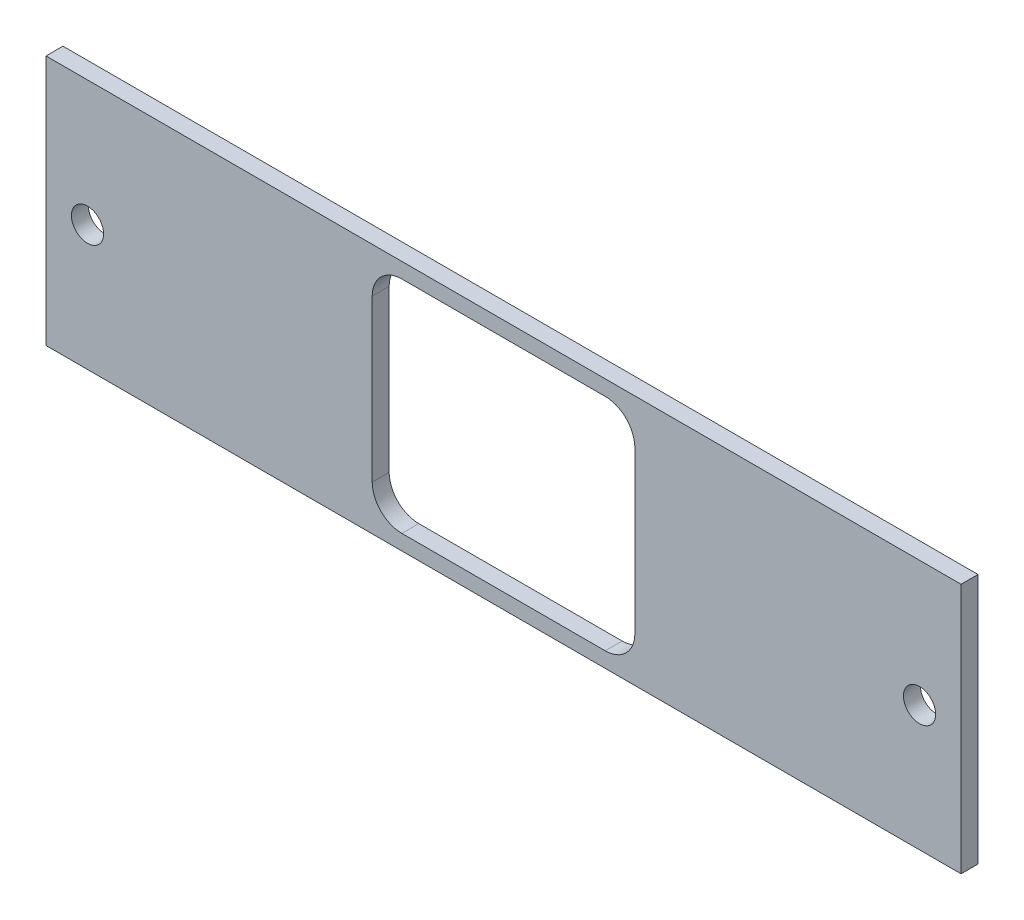
ISO-10303-21;
HEADER;
FILE_DESCRIPTION(('STEP AP214'),'2;1');
FILE_NAME('part.step','',(''),(''),'','','');
FILE_SCHEMA(('AUTOMOTIVE_DESIGN { 1 0 10303 214 1 1 1 1 }'));
ENDSEC;
DATA;
#1=APPLICATION_CONTEXT('core data for automotive mechanical design processes');
#2=APPLICATION_PROTOCOL_DEFINITION('international standard','automotive_design',2000,#1);
#3=PRODUCT_CONTEXT('',#1,'mechanical');
#4=PRODUCT('Part','Part','',(#3));
#5=PRODUCT_RELATED_PRODUCT_CATEGORY('part','',(#4));
#6=PRODUCT_DEFINITION_FORMATION('','',#4);
#7=PRODUCT_DEFINITION_CONTEXT('part definition',#1,'design');
#8=PRODUCT_DEFINITION('design','',#6,#7);
#9=PRODUCT_DEFINITION_SHAPE('','',#8);
#10=(LENGTH_UNIT() NAMED_UNIT(*) SI_UNIT(.MILLI.,.METRE.));
#11=(NAMED_UNIT(*) PLANE_ANGLE_UNIT() SI_UNIT($,.RADIAN.));
#12=(NAMED_UNIT(*) SI_UNIT($,.STERADIAN.) SOLID_ANGLE_UNIT());
#13=UNCERTAINTY_MEASURE_WITH_UNIT(LENGTH_MEASURE(1.E-05),#10,'distance_accuracy_value','');
#14=(GEOMETRIC_REPRESENTATION_CONTEXT(3) GLOBAL_UNCERTAINTY_ASSIGNED_CONTEXT((#13)) GLOBAL_UNIT_ASSIGNED_CONTEXT((#10,
#11,#12)) REPRESENTATION_CONTEXT('',''));
#15=CARTESIAN_POINT('',(0.,0.,0.));
#16=DIRECTION('',(0.,0.,1.));
#17=DIRECTION('',(1.,0.,0.));
#18=AXIS2_PLACEMENT_3D('',#15,#16,#17);
#19=CARTESIAN_POINT('',(54.,-14.8,-2.));
#20=DIRECTION('',(1.,0.,0.));
#21=DIRECTION('',(0.,0.,-1.));
#22=AXIS2_PLACEMENT_3D('',#19,#20,#21);
#23=PLANE('',#22);
#24=DIRECTION('',(0.,1.,0.));
#25=VECTOR('',#24,1.);
#26=CARTESIAN_POINT('',(54.,-14.8,0.));
#27=LINE('',#26,#25);
#28=CARTESIAN_POINT('',(54.,-14.8,0.));
#29=VERTEX_POINT('',#28);
#30=CARTESIAN_POINT('',(54.,14.8,0.));
#31=VERTEX_POINT('',#30);
#32=EDGE_CURVE('E200',#29,#31,#27,.T.);
#33=ORIENTED_EDGE('',*,*,#32,.F.);
#34=DIRECTION('',(0.,0.,1.));
#35=VECTOR('',#34,1.);
#36=CARTESIAN_POINT('',(54.,-14.8,-2.));
#37=LINE('',#36,#35);
#38=CARTESIAN_POINT('',(54.,-14.8,-2.));
#39=VERTEX_POINT('',#38);
#40=EDGE_CURVE('E11',#39,#29,#37,.T.);
#41=ORIENTED_EDGE('',*,*,#40,.F.);
#42=DIRECTION('',(0.,1.,0.));
#43=VECTOR('',#42,1.);
#44=CARTESIAN_POINT('',(54.,-14.8,-2.));
#45=LINE('',#44,#43);
#46=CARTESIAN_POINT('',(54.,14.8,-2.));
#47=VERTEX_POINT('',#46);
#48=EDGE_CURVE('E203',#39,#47,#45,.T.);
#49=ORIENTED_EDGE('',*,*,#48,.T.);
#50=DIRECTION('',(0.,0.,1.));
#51=VECTOR('',#50,1.);
#52=CARTESIAN_POINT('',(54.,14.8,-2.));
#53=LINE('',#52,#51);
#54=EDGE_CURVE('E36',#47,#31,#53,.T.);
#55=ORIENTED_EDGE('',*,*,#54,.T.);
#56=EDGE_LOOP('',(#33,#41,#49,#55));
#57=FACE_BOUND('',#56,.T.);
#58=ADVANCED_FACE('F33',(#57),#23,.T.);
#59=CARTESIAN_POINT('',(-54.,-14.8,-2.));
#60=DIRECTION('',(0.,-1.,0.));
#61=DIRECTION('',(0.,0.,-1.));
#62=AXIS2_PLACEMENT_3D('',#59,#60,#61);
#63=PLANE('',#62);
#64=DIRECTION('',(1.,0.,0.));
#65=VECTOR('',#64,1.);
#66=CARTESIAN_POINT('',(-54.,-14.8,0.));
#67=LINE('',#66,#65);
#68=CARTESIAN_POINT('',(-54.,-14.8,0.));
#69=VERTEX_POINT('',#68);
#70=EDGE_CURVE('E207',#69,#29,#67,.T.);
#71=ORIENTED_EDGE('',*,*,#70,.F.);
#72=DIRECTION('',(0.,0.,1.));
#73=VECTOR('',#72,1.);
#74=CARTESIAN_POINT('',(-54.,-14.8,-2.));
#75=LINE('',#74,#73);
#76=CARTESIAN_POINT('',(-54.,-14.8,-2.));
#77=VERTEX_POINT('',#76);
#78=EDGE_CURVE('E41',#77,#69,#75,.T.);
#79=ORIENTED_EDGE('',*,*,#78,.F.);
#80=DIRECTION('',(1.,0.,0.));
#81=VECTOR('',#80,1.);
#82=CARTESIAN_POINT('',(-54.,-14.8,-2.));
#83=LINE('',#82,#81);
#84=EDGE_CURVE('E213',#77,#39,#83,.T.);
#85=ORIENTED_EDGE('',*,*,#84,.T.);
#86=ORIENTED_EDGE('',*,*,#40,.T.);
#87=EDGE_LOOP('',(#71,#79,#85,#86));
#88=FACE_BOUND('',#87,.T.);
#89=ADVANCED_FACE('F239',(#88),#63,.T.);
#90=CARTESIAN_POINT('',(-54.,-14.8,-2.));
#91=DIRECTION('',(-1.,0.,0.));
#92=DIRECTION('',(0.,0.,1.));
#93=AXIS2_PLACEMENT_3D('',#90,#91,#92);
#94=PLANE('',#93);
#95=DIRECTION('',(0.,-1.,0.));
#96=VECTOR('',#95,1.);
#97=CARTESIAN_POINT('',(-54.,-14.8,0.));
#98=LINE('',#97,#96);
#99=CARTESIAN_POINT('',(-54.,14.8,0.));
#100=VERTEX_POINT('',#99);
#101=EDGE_CURVE('E221',#100,#69,#98,.T.);
#102=ORIENTED_EDGE('',*,*,#101,.F.);
#103=DIRECTION('',(0.,0.,1.));
#104=VECTOR('',#103,1.);
#105=CARTESIAN_POINT('',(-54.,14.8,-2.));
#106=LINE('',#105,#104);
#107=CARTESIAN_POINT('',(-54.,14.8,-2.));
#108=VERTEX_POINT('',#107);
#109=EDGE_CURVE('E226',#108,#100,#106,.T.);
#110=ORIENTED_EDGE('',*,*,#109,.F.);
#111=DIRECTION('',(0.,-1.,0.));
#112=VECTOR('',#111,1.);
#113=CARTESIAN_POINT('',(-54.,-14.8,-2.));
#114=LINE('',#113,#112);
#115=EDGE_CURVE('E210',#108,#77,#114,.T.);
#116=ORIENTED_EDGE('',*,*,#115,.T.);
#117=ORIENTED_EDGE('',*,*,#78,.T.);
#118=EDGE_LOOP('',(#102,#110,#116,#117));
#119=FACE_BOUND('',#118,.T.);
#120=ADVANCED_FACE('F244',(#119),#94,.T.);
#121=CARTESIAN_POINT('',(-54.,14.8,-2.));
#122=DIRECTION('',(0.,1.,0.));
#123=DIRECTION('',(0.,0.,1.));
#124=AXIS2_PLACEMENT_3D('',#121,#122,#123);
#125=PLANE('',#124);
#126=DIRECTION('',(-1.,0.,0.));
#127=VECTOR('',#126,1.);
#128=CARTESIAN_POINT('',(-54.,14.8,0.));
#129=LINE('',#128,#127);
#130=EDGE_CURVE('E218',#31,#100,#129,.T.);
#131=ORIENTED_EDGE('',*,*,#130,.F.);
#132=ORIENTED_EDGE('',*,*,#54,.F.);
#133=DIRECTION('',(-1.,0.,0.));
#134=VECTOR('',#133,1.);
#135=CARTESIAN_POINT('',(-54.,14.8,-2.));
#136=LINE('',#135,#134);
#137=EDGE_CURVE('E206',#47,#108,#136,.T.);
#138=ORIENTED_EDGE('',*,*,#137,.T.);
#139=ORIENTED_EDGE('',*,*,#109,.T.);
#140=EDGE_LOOP('',(#131,#132,#138,#139));
#141=FACE_BOUND('',#140,.T.);
#142=ADVANCED_FACE('F234',(#141),#125,.T.);
#143=CARTESIAN_POINT('',(54.,14.8,-2.));
#144=DIRECTION('',(0.,0.,-1.));
#145=DIRECTION('',(-1.,0.,0.));
#146=AXIS2_PLACEMENT_3D('',#143,#144,#145);
#147=PLANE('',#146);
#148=CARTESIAN_POINT('',(-12.,-9.50000000000004,-2.));
#149=DIRECTION('',(0.,0.,1.));
#150=DIRECTION('',(1.,0.,0.));
#151=AXIS2_PLACEMENT_3D('',#148,#149,#150);
#152=CIRCLE('',#151,3.5);
#153=CARTESIAN_POINT('',(-15.5,-9.50000000000005,-2.));
#154=VERTEX_POINT('',#153);
#155=CARTESIAN_POINT('',(-12.,-13.,-2.));
#156=VERTEX_POINT('',#155);
#157=EDGE_CURVE('E124',#154,#156,#152,.T.);
#158=ORIENTED_EDGE('',*,*,#157,.T.);
#159=DIRECTION('',(1.,0.,0.));
#160=VECTOR('',#159,1.);
#161=CARTESIAN_POINT('',(-12.,-13.,-2.));
#162=LINE('',#161,#160);
#163=CARTESIAN_POINT('',(12.,-13.,-2.));
#164=VERTEX_POINT('',#163);
#165=EDGE_CURVE('E133',#156,#164,#162,.T.);
#166=ORIENTED_EDGE('',*,*,#165,.T.);
#167=CARTESIAN_POINT('',(12.,-9.49999999999996,-2.));
#168=DIRECTION('',(0.,0.,1.));
#169=DIRECTION('',(1.,0.,0.));
#170=AXIS2_PLACEMENT_3D('',#167,#168,#169);
#171=CIRCLE('',#170,3.5);
#172=CARTESIAN_POINT('',(15.5,-9.49999999999995,-2.));
#173=VERTEX_POINT('',#172);
#174=EDGE_CURVE('E49',#164,#173,#171,.T.);
#175=ORIENTED_EDGE('',*,*,#174,.T.);
#176=DIRECTION('',(0.,1.,0.));
#177=VECTOR('',#176,1.);
#178=CARTESIAN_POINT('',(15.5,-9.49999999999995,-2.));
#179=LINE('',#178,#177);
#180=CARTESIAN_POINT('',(15.5,9.50000000000005,-2.));
#181=VERTEX_POINT('',#180);
#182=EDGE_CURVE('E148',#173,#181,#179,.T.);
#183=ORIENTED_EDGE('',*,*,#182,.T.);
#184=CARTESIAN_POINT('',(12.,9.50000000000004,-2.));
#185=DIRECTION('',(0.,0.,1.));
#186=DIRECTION('',(1.,0.,0.));
#187=AXIS2_PLACEMENT_3D('',#184,#185,#186);
#188=CIRCLE('',#187,3.5);
#189=CARTESIAN_POINT('',(12.,13.,-2.));
#190=VERTEX_POINT('',#189);
#191=EDGE_CURVE('E151',#181,#190,#188,.T.);
#192=ORIENTED_EDGE('',*,*,#191,.T.);
#193=DIRECTION('',(-1.,0.,0.));
#194=VECTOR('',#193,1.);
#195=CARTESIAN_POINT('',(12.,13.,-2.));
#196=LINE('',#195,#194);
#197=CARTESIAN_POINT('',(-12.,13.,-2.));
#198=VERTEX_POINT('',#197);
#199=EDGE_CURVE('E154',#190,#198,#196,.T.);
#200=ORIENTED_EDGE('',*,*,#199,.T.);
#201=CARTESIAN_POINT('',(-12.,9.49999999999996,-2.));
#202=DIRECTION('',(0.,0.,1.));
#203=DIRECTION('',(1.,0.,0.));
#204=AXIS2_PLACEMENT_3D('',#201,#202,#203);
#205=CIRCLE('',#204,3.5);
#206=CARTESIAN_POINT('',(-15.5,9.49999999999995,-2.));
#207=VERTEX_POINT('',#206);
#208=EDGE_CURVE('E157',#198,#207,#205,.T.);
#209=ORIENTED_EDGE('',*,*,#208,.T.);
#210=DIRECTION('',(0.,-1.,0.));
#211=VECTOR('',#210,1.);
#212=CARTESIAN_POINT('',(-15.5,9.49999999999995,-2.));
#213=LINE('',#212,#211);
#214=EDGE_CURVE('E130',#207,#154,#213,.T.);
#215=ORIENTED_EDGE('',*,*,#214,.T.);
#216=EDGE_LOOP('',(#158,#166,#175,#183,#192,#200,#209,#215));
#217=FACE_BOUND('',#216,.T.);
#218=CARTESIAN_POINT('',(49.1,0.,-2.));
#219=DIRECTION('',(0.,0.,1.));
#220=DIRECTION('',(1.,0.,0.));
#221=AXIS2_PLACEMENT_3D('',#218,#219,#220);
#222=CIRCLE('',#221,1.9);
#223=CARTESIAN_POINT('',(51.,0.,-2.));
#224=VERTEX_POINT('',#223);
#225=EDGE_CURVE('E191',#224,#224,#222,.T.);
#226=ORIENTED_EDGE('',*,*,#225,.T.);
#227=EDGE_LOOP('',(#226));
#228=FACE_BOUND('',#227,.T.);
#229=CARTESIAN_POINT('',(-49.1,0.,-2.));
#230=DIRECTION('',(0.,0.,1.));
#231=DIRECTION('',(1.,0.,0.));
#232=AXIS2_PLACEMENT_3D('',#229,#230,#231);
#233=CIRCLE('',#232,1.9);
#234=CARTESIAN_POINT('',(-47.2,0.,-2.));
#235=VERTEX_POINT('',#234);
#236=EDGE_CURVE('E197',#235,#235,#233,.T.);
#237=ORIENTED_EDGE('',*,*,#236,.T.);
#238=EDGE_LOOP('',(#237));
#239=FACE_BOUND('',#238,.T.);
#240=ORIENTED_EDGE('',*,*,#48,.F.);
#241=ORIENTED_EDGE('',*,*,#84,.F.);
#242=ORIENTED_EDGE('',*,*,#115,.F.);
#243=ORIENTED_EDGE('',*,*,#137,.F.);
#244=EDGE_LOOP('',(#240,#241,#242,#243));
#245=FACE_BOUND('',#244,.T.);
#246=ADVANCED_FACE('F137',(#217,#228,#239,#245),#147,.T.);
#247=CARTESIAN_POINT('',(54.,14.8,0.));
#248=DIRECTION('',(0.,0.,-1.));
#249=DIRECTION('',(-1.,0.,0.));
#250=AXIS2_PLACEMENT_3D('',#247,#248,#249);
#251=PLANE('',#250);
#252=DIRECTION('',(1.,0.,0.));
#253=VECTOR('',#252,1.);
#254=CARTESIAN_POINT('',(-12.,-13.,0.));
#255=LINE('',#254,#253);
#256=CARTESIAN_POINT('',(-11.9999999999999,-13.,0.));
#257=VERTEX_POINT('',#256);
#258=CARTESIAN_POINT('',(12.,-13.,0.));
#259=VERTEX_POINT('',#258);
#260=EDGE_CURVE('E161',#257,#259,#255,.T.);
#261=ORIENTED_EDGE('',*,*,#260,.F.);
#262=CARTESIAN_POINT('',(-12.,-9.50000000000004,0.));
#263=DIRECTION('',(0.,0.,1.));
#264=DIRECTION('',(1.,0.,0.));
#265=AXIS2_PLACEMENT_3D('',#262,#263,#264);
#266=CIRCLE('',#265,3.5);
#267=CARTESIAN_POINT('',(-15.5,-9.50000000000005,0.));
#268=VERTEX_POINT('',#267);
#269=EDGE_CURVE('E57',#268,#257,#266,.T.);
#270=ORIENTED_EDGE('',*,*,#269,.F.);
#271=DIRECTION('',(0.,-1.,0.));
#272=VECTOR('',#271,1.);
#273=CARTESIAN_POINT('',(-15.5,9.49999999999995,0.));
#274=LINE('',#273,#272);
#275=CARTESIAN_POINT('',(-15.5,9.49999999999995,0.));
#276=VERTEX_POINT('',#275);
#277=EDGE_CURVE('E141',#276,#268,#274,.T.);
#278=ORIENTED_EDGE('',*,*,#277,.F.);
#279=CARTESIAN_POINT('',(-12.,9.49999999999996,0.));
#280=DIRECTION('',(0.,0.,1.));
#281=DIRECTION('',(1.,0.,0.));
#282=AXIS2_PLACEMENT_3D('',#279,#280,#281);
#283=CIRCLE('',#282,3.5);
#284=CARTESIAN_POINT('',(-12.,13.,0.));
#285=VERTEX_POINT('',#284);
#286=EDGE_CURVE('E144',#285,#276,#283,.T.);
#287=ORIENTED_EDGE('',*,*,#286,.F.);
#288=DIRECTION('',(-1.,0.,0.));
#289=VECTOR('',#288,1.);
#290=CARTESIAN_POINT('',(12.,13.,0.));
#291=LINE('',#290,#289);
#292=CARTESIAN_POINT('',(12.,13.,0.));
#293=VERTEX_POINT('',#292);
#294=EDGE_CURVE('E172',#293,#285,#291,.T.);
#295=ORIENTED_EDGE('',*,*,#294,.F.);
#296=CARTESIAN_POINT('',(12.,9.50000000000004,0.));
#297=DIRECTION('',(0.,0.,1.));
#298=DIRECTION('',(1.,0.,0.));
#299=AXIS2_PLACEMENT_3D('',#296,#297,#298);
#300=CIRCLE('',#299,3.5);
#301=CARTESIAN_POINT('',(15.5,9.50000000000005,0.));
#302=VERTEX_POINT('',#301);
#303=EDGE_CURVE('E169',#302,#293,#300,.T.);
#304=ORIENTED_EDGE('',*,*,#303,.F.);
#305=DIRECTION('',(0.,1.,0.));
#306=VECTOR('',#305,1.);
#307=CARTESIAN_POINT('',(15.5,-9.49999999999995,0.));
#308=LINE('',#307,#306);
#309=CARTESIAN_POINT('',(15.5,-9.49999999999995,0.));
#310=VERTEX_POINT('',#309);
#311=EDGE_CURVE('E166',#310,#302,#308,.T.);
#312=ORIENTED_EDGE('',*,*,#311,.F.);
#313=CARTESIAN_POINT('',(12.,-9.49999999999996,0.));
#314=DIRECTION('',(0.,0.,1.));
#315=DIRECTION('',(1.,0.,0.));
#316=AXIS2_PLACEMENT_3D('',#313,#314,#315);
#317=CIRCLE('',#316,3.5);
#318=EDGE_CURVE('E163',#259,#310,#317,.T.);
#319=ORIENTED_EDGE('',*,*,#318,.F.);
#320=EDGE_LOOP('',(#261,#270,#278,#287,#295,#304,#312,#319));
#321=FACE_BOUND('',#320,.T.);
#322=CARTESIAN_POINT('',(49.1,0.,0.));
#323=DIRECTION('',(0.,0.,1.));
#324=DIRECTION('',(1.,0.,0.));
#325=AXIS2_PLACEMENT_3D('',#322,#323,#324);
#326=CIRCLE('',#325,1.9);
#327=CARTESIAN_POINT('',(51.,0.,0.));
#328=VERTEX_POINT('',#327);
#329=EDGE_CURVE('E179',#328,#328,#326,.T.);
#330=ORIENTED_EDGE('',*,*,#329,.F.);
#331=EDGE_LOOP('',(#330));
#332=FACE_BOUND('',#331,.T.);
#333=CARTESIAN_POINT('',(-49.1,0.,0.));
#334=DIRECTION('',(0.,0.,1.));
#335=DIRECTION('',(1.,0.,0.));
#336=AXIS2_PLACEMENT_3D('',#333,#334,#335);
#337=CIRCLE('',#336,1.9);
#338=CARTESIAN_POINT('',(-47.2,0.,0.));
#339=VERTEX_POINT('',#338);
#340=EDGE_CURVE('E194',#339,#339,#337,.T.);
#341=ORIENTED_EDGE('',*,*,#340,.F.);
#342=EDGE_LOOP('',(#341));
#343=FACE_BOUND('',#342,.T.);
#344=ORIENTED_EDGE('',*,*,#32,.T.);
#345=ORIENTED_EDGE('',*,*,#130,.T.);
#346=ORIENTED_EDGE('',*,*,#101,.T.);
#347=ORIENTED_EDGE('',*,*,#70,.T.);
#348=EDGE_LOOP('',(#344,#345,#346,#347));
#349=FACE_BOUND('',#348,.T.);
#350=ADVANCED_FACE('F236',(#321,#332,#343,#349),#251,.F.);
#351=CARTESIAN_POINT('',(-49.1,0.,-2.));
#352=DIRECTION('',(0.,0.,1.));
#353=DIRECTION('',(1.,0.,0.));
#354=AXIS2_PLACEMENT_3D('',#351,#352,#353);
#355=CYLINDRICAL_SURFACE('',#354,1.9);
#356=ORIENTED_EDGE('',*,*,#236,.F.);
#357=EDGE_LOOP('',(#356));
#358=FACE_BOUND('',#357,.T.);
#359=ORIENTED_EDGE('',*,*,#340,.T.);
#360=EDGE_LOOP('',(#359));
#361=FACE_BOUND('',#360,.T.);
#362=ADVANCED_FACE('F279',(#358,#361),#355,.F.);
#363=CARTESIAN_POINT('',(49.1,0.,-2.));
#364=DIRECTION('',(0.,0.,1.));
#365=DIRECTION('',(1.,0.,0.));
#366=AXIS2_PLACEMENT_3D('',#363,#364,#365);
#367=CYLINDRICAL_SURFACE('',#366,1.9);
#368=ORIENTED_EDGE('',*,*,#225,.F.);
#369=EDGE_LOOP('',(#368));
#370=FACE_BOUND('',#369,.T.);
#371=ORIENTED_EDGE('',*,*,#329,.T.);
#372=EDGE_LOOP('',(#371));
#373=FACE_BOUND('',#372,.T.);
#374=ADVANCED_FACE('F284',(#370,#373),#367,.F.);
#375=CARTESIAN_POINT('',(-12.,-9.50000000000004,-2.));
#376=DIRECTION('',(0.,0.,1.));
#377=DIRECTION('',(1.,0.,0.));
#378=AXIS2_PLACEMENT_3D('',#375,#376,#377);
#379=CYLINDRICAL_SURFACE('',#378,3.5);
#380=ORIENTED_EDGE('',*,*,#269,.T.);
#381=DIRECTION('',(0.,0.,1.));
#382=VECTOR('',#381,1.);
#383=CARTESIAN_POINT('',(-12.,-13.,-2.));
#384=LINE('',#383,#382);
#385=EDGE_CURVE('E120',#156,#257,#384,.T.);
#386=ORIENTED_EDGE('',*,*,#385,.F.);
#387=ORIENTED_EDGE('',*,*,#157,.F.);
#388=DIRECTION('',(0.,0.,1.));
#389=VECTOR('',#388,1.);
#390=CARTESIAN_POINT('',(-15.5,-9.50000000000005,-2.));
#391=LINE('',#390,#389);
#392=EDGE_CURVE('E177',#154,#268,#391,.T.);
#393=ORIENTED_EDGE('',*,*,#392,.T.);
#394=EDGE_LOOP('',(#380,#386,#387,#393));
#395=FACE_BOUND('',#394,.T.);
#396=ADVANCED_FACE('F122',(#395),#379,.F.);
#397=CARTESIAN_POINT('',(-15.5,9.49999999999995,-2.));
#398=DIRECTION('',(-1.,0.,0.));
#399=DIRECTION('',(0.,-1.,0.));
#400=AXIS2_PLACEMENT_3D('',#397,#398,#399);
#401=PLANE('',#400);
#402=ORIENTED_EDGE('',*,*,#277,.T.);
#403=ORIENTED_EDGE('',*,*,#392,.F.);
#404=ORIENTED_EDGE('',*,*,#214,.F.);
#405=DIRECTION('',(0.,0.,1.));
#406=VECTOR('',#405,1.);
#407=CARTESIAN_POINT('',(-15.5,9.49999999999995,-2.));
#408=LINE('',#407,#406);
#409=EDGE_CURVE('E180',#207,#276,#408,.T.);
#410=ORIENTED_EDGE('',*,*,#409,.T.);
#411=EDGE_LOOP('',(#402,#403,#404,#410));
#412=FACE_BOUND('',#411,.T.);
#413=ADVANCED_FACE('F314',(#412),#401,.F.);
#414=CARTESIAN_POINT('',(-12.,9.49999999999996,-2.));
#415=DIRECTION('',(0.,0.,1.));
#416=DIRECTION('',(1.,0.,0.));
#417=AXIS2_PLACEMENT_3D('',#414,#415,#416);
#418=CYLINDRICAL_SURFACE('',#417,3.5);
#419=ORIENTED_EDGE('',*,*,#286,.T.);
#420=ORIENTED_EDGE('',*,*,#409,.F.);
#421=ORIENTED_EDGE('',*,*,#208,.F.);
#422=DIRECTION('',(0.,0.,1.));
#423=VECTOR('',#422,1.);
#424=CARTESIAN_POINT('',(-12.,13.,-2.));
#425=LINE('',#424,#423);
#426=EDGE_CURVE('E182',#198,#285,#425,.T.);
#427=ORIENTED_EDGE('',*,*,#426,.T.);
#428=EDGE_LOOP('',(#419,#420,#421,#427));
#429=FACE_BOUND('',#428,.T.);
#430=ADVANCED_FACE('F323',(#429),#418,.F.);
#431=CARTESIAN_POINT('',(12.,13.,-2.));
#432=DIRECTION('',(0.,1.,0.));
#433=DIRECTION('',(-1.,0.,0.));
#434=AXIS2_PLACEMENT_3D('',#431,#432,#433);
#435=PLANE('',#434);
#436=ORIENTED_EDGE('',*,*,#294,.T.);
#437=ORIENTED_EDGE('',*,*,#426,.F.);
#438=ORIENTED_EDGE('',*,*,#199,.F.);
#439=DIRECTION('',(0.,0.,1.));
#440=VECTOR('',#439,1.);
#441=CARTESIAN_POINT('',(12.,13.,-2.));
#442=LINE('',#441,#440);
#443=EDGE_CURVE('E184',#190,#293,#442,.T.);
#444=ORIENTED_EDGE('',*,*,#443,.T.);
#445=EDGE_LOOP('',(#436,#437,#438,#444));
#446=FACE_BOUND('',#445,.T.);
#447=ADVANCED_FACE('F333',(#446),#435,.F.);
#448=CARTESIAN_POINT('',(12.,9.50000000000004,-2.));
#449=DIRECTION('',(0.,0.,1.));
#450=DIRECTION('',(1.,0.,0.));
#451=AXIS2_PLACEMENT_3D('',#448,#449,#450);
#452=CYLINDRICAL_SURFACE('',#451,3.5);
#453=ORIENTED_EDGE('',*,*,#303,.T.);
#454=ORIENTED_EDGE('',*,*,#443,.F.);
#455=ORIENTED_EDGE('',*,*,#191,.F.);
#456=DIRECTION('',(0.,0.,1.));
#457=VECTOR('',#456,1.);
#458=CARTESIAN_POINT('',(15.5,9.50000000000005,-2.));
#459=LINE('',#458,#457);
#460=EDGE_CURVE('E186',#181,#302,#459,.T.);
#461=ORIENTED_EDGE('',*,*,#460,.T.);
#462=EDGE_LOOP('',(#453,#454,#455,#461));
#463=FACE_BOUND('',#462,.T.);
#464=ADVANCED_FACE('F343',(#463),#452,.F.);
#465=CARTESIAN_POINT('',(15.5,-9.49999999999995,-2.));
#466=DIRECTION('',(1.,0.,0.));
#467=DIRECTION('',(0.,1.,0.));
#468=AXIS2_PLACEMENT_3D('',#465,#466,#467);
#469=PLANE('',#468);
#470=ORIENTED_EDGE('',*,*,#311,.T.);
#471=ORIENTED_EDGE('',*,*,#460,.F.);
#472=ORIENTED_EDGE('',*,*,#182,.F.);
#473=DIRECTION('',(0.,0.,1.));
#474=VECTOR('',#473,1.);
#475=CARTESIAN_POINT('',(15.5,-9.49999999999995,-2.));
#476=LINE('',#475,#474);
#477=EDGE_CURVE('E188',#173,#310,#476,.T.);
#478=ORIENTED_EDGE('',*,*,#477,.T.);
#479=EDGE_LOOP('',(#470,#471,#472,#478));
#480=FACE_BOUND('',#479,.T.);
#481=ADVANCED_FACE('F353',(#480),#469,.F.);
#482=CARTESIAN_POINT('',(12.,-9.49999999999996,-2.));
#483=DIRECTION('',(0.,0.,1.));
#484=DIRECTION('',(1.,0.,0.));
#485=AXIS2_PLACEMENT_3D('',#482,#483,#484);
#486=CYLINDRICAL_SURFACE('',#485,3.5);
#487=ORIENTED_EDGE('',*,*,#318,.T.);
#488=ORIENTED_EDGE('',*,*,#477,.F.);
#489=ORIENTED_EDGE('',*,*,#174,.F.);
#490=DIRECTION('',(0.,0.,1.));
#491=VECTOR('',#490,1.);
#492=CARTESIAN_POINT('',(12.,-13.,-2.));
#493=LINE('',#492,#491);
#494=EDGE_CURVE('E129',#164,#259,#493,.T.);
#495=ORIENTED_EDGE('',*,*,#494,.T.);
#496=EDGE_LOOP('',(#487,#488,#489,#495));
#497=FACE_BOUND('',#496,.T.);
#498=ADVANCED_FACE('F363',(#497),#486,.F.);
#499=CARTESIAN_POINT('',(-12.,-13.,-2.));
#500=DIRECTION('',(0.,-1.,0.));
#501=DIRECTION('',(1.,0.,0.));
#502=AXIS2_PLACEMENT_3D('',#499,#500,#501);
#503=PLANE('',#502);
#504=ORIENTED_EDGE('',*,*,#260,.T.);
#505=ORIENTED_EDGE('',*,*,#494,.F.);
#506=ORIENTED_EDGE('',*,*,#165,.F.);
#507=ORIENTED_EDGE('',*,*,#385,.T.);
#508=EDGE_LOOP('',(#504,#505,#506,#507));
#509=FACE_BOUND('',#508,.T.);
#510=ADVANCED_FACE('F134',(#509),#503,.F.);
#511=CLOSED_SHELL('',(#58,#89,#120,#142,#246,#350,#362,#374,#396,#413,#430,#447,#464,#481,#498,#510));
#512=MANIFOLD_SOLID_BREP('B2',#511);
#513=ADVANCED_BREP_SHAPE_REPRESENTATION('',(#18,#512),#14);
#514=SHAPE_DEFINITION_REPRESENTATION(#9,#513);
ENDSEC;
END-ISO-10303-21;
